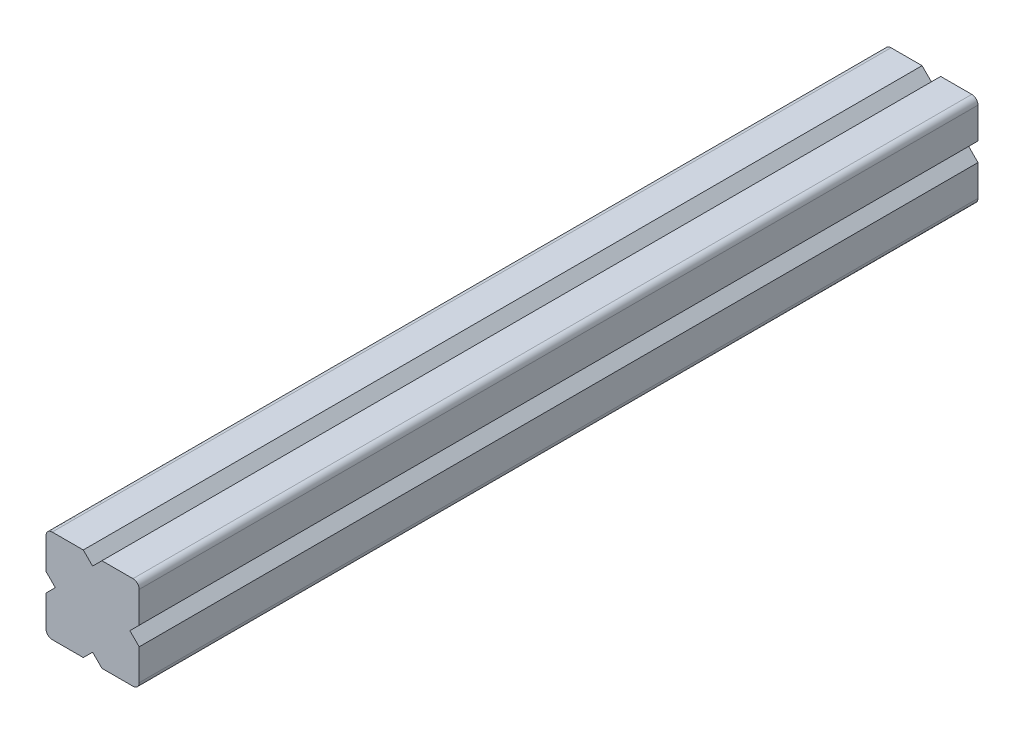
ISO-10303-21;
HEADER;
FILE_DESCRIPTION(('STEP AP214'),'2;1');
FILE_NAME('part.step','',(''),(''),'','','');
FILE_SCHEMA(('AUTOMOTIVE_DESIGN { 1 0 10303 214 1 1 1 1 }'));
ENDSEC;
DATA;
#1=APPLICATION_CONTEXT('core data for automotive mechanical design processes');
#2=APPLICATION_PROTOCOL_DEFINITION('international standard','automotive_design',2000,#1);
#3=PRODUCT_CONTEXT('',#1,'mechanical');
#4=PRODUCT('Part','Part','',(#3));
#5=PRODUCT_RELATED_PRODUCT_CATEGORY('part','',(#4));
#6=PRODUCT_DEFINITION_FORMATION('','',#4);
#7=PRODUCT_DEFINITION_CONTEXT('part definition',#1,'design');
#8=PRODUCT_DEFINITION('design','',#6,#7);
#9=PRODUCT_DEFINITION_SHAPE('','',#8);
#10=(LENGTH_UNIT() NAMED_UNIT(*) SI_UNIT(.MILLI.,.METRE.));
#11=(NAMED_UNIT(*) PLANE_ANGLE_UNIT() SI_UNIT($,.RADIAN.));
#12=(NAMED_UNIT(*) SI_UNIT($,.STERADIAN.) SOLID_ANGLE_UNIT());
#13=UNCERTAINTY_MEASURE_WITH_UNIT(LENGTH_MEASURE(1.E-05),#10,'distance_accuracy_value','');
#14=(GEOMETRIC_REPRESENTATION_CONTEXT(3) GLOBAL_UNCERTAINTY_ASSIGNED_CONTEXT((#13)) GLOBAL_UNIT_ASSIGNED_CONTEXT((#10,
#11,#12)) REPRESENTATION_CONTEXT('',''));
#15=CARTESIAN_POINT('',(0.,0.,0.));
#16=DIRECTION('',(0.,0.,1.));
#17=DIRECTION('',(1.,0.,0.));
#18=AXIS2_PLACEMENT_3D('',#15,#16,#17);
#19=CARTESIAN_POINT('',(15.,0.,135.));
#20=DIRECTION('',(-1.,0.,0.));
#21=DIRECTION('',(0.,-1.,0.));
#22=AXIS2_PLACEMENT_3D('',#19,#20,#21);
#23=PLANE('',#22);
#24=DIRECTION('',(0.,1.,0.));
#25=VECTOR('',#24,1.);
#26=CARTESIAN_POINT('',(15.,0.,-135.));
#27=LINE('',#26,#25);
#28=CARTESIAN_POINT('',(15.,2.9999999999999,-135.));
#29=VERTEX_POINT('',#28);
#30=CARTESIAN_POINT('',(15.,13.,-135.));
#31=VERTEX_POINT('',#30);
#32=EDGE_CURVE('E200',#29,#31,#27,.T.);
#33=ORIENTED_EDGE('',*,*,#32,.T.);
#34=DIRECTION('',(0.,0.,-1.));
#35=VECTOR('',#34,1.);
#36=CARTESIAN_POINT('',(15.,13.,135.));
#37=LINE('',#36,#35);
#38=CARTESIAN_POINT('',(15.,13.,135.));
#39=VERTEX_POINT('',#38);
#40=EDGE_CURVE('E11',#39,#31,#37,.T.);
#41=ORIENTED_EDGE('',*,*,#40,.F.);
#42=DIRECTION('',(0.,1.,0.));
#43=VECTOR('',#42,1.);
#44=CARTESIAN_POINT('',(15.,0.,135.));
#45=LINE('',#44,#43);
#46=CARTESIAN_POINT('',(15.,2.9999999999999,135.));
#47=VERTEX_POINT('',#46);
#48=EDGE_CURVE('E242',#47,#39,#45,.T.);
#49=ORIENTED_EDGE('',*,*,#48,.F.);
#50=DIRECTION('',(0.,0.,-1.));
#51=VECTOR('',#50,1.);
#52=CARTESIAN_POINT('',(15.,2.9999999999999,135.));
#53=LINE('',#52,#51);
#54=EDGE_CURVE('E196',#47,#29,#53,.T.);
#55=ORIENTED_EDGE('',*,*,#54,.T.);
#56=EDGE_LOOP('',(#33,#41,#49,#55));
#57=FACE_BOUND('',#56,.T.);
#58=ADVANCED_FACE('F33',(#57),#23,.F.);
#59=CARTESIAN_POINT('',(13.,13.,135.));
#60=DIRECTION('',(0.,0.,-1.));
#61=DIRECTION('',(-1.,0.,0.));
#62=AXIS2_PLACEMENT_3D('',#59,#60,#61);
#63=CYLINDRICAL_SURFACE('',#62,2.);
#64=CARTESIAN_POINT('',(13.,13.,-135.));
#65=DIRECTION('',(0.,0.,1.));
#66=DIRECTION('',(1.,0.,0.));
#67=AXIS2_PLACEMENT_3D('',#64,#65,#66);
#68=CIRCLE('',#67,2.);
#69=CARTESIAN_POINT('',(13.,15.,-135.));
#70=VERTEX_POINT('',#69);
#71=EDGE_CURVE('E203',#31,#70,#68,.T.);
#72=ORIENTED_EDGE('',*,*,#71,.T.);
#73=DIRECTION('',(0.,0.,-1.));
#74=VECTOR('',#73,1.);
#75=CARTESIAN_POINT('',(13.,15.,135.));
#76=LINE('',#75,#74);
#77=CARTESIAN_POINT('',(13.,15.,135.));
#78=VERTEX_POINT('',#77);
#79=EDGE_CURVE('E41',#78,#70,#76,.T.);
#80=ORIENTED_EDGE('',*,*,#79,.F.);
#81=CARTESIAN_POINT('',(13.,13.,135.));
#82=DIRECTION('',(0.,0.,1.));
#83=DIRECTION('',(1.,0.,0.));
#84=AXIS2_PLACEMENT_3D('',#81,#82,#83);
#85=CIRCLE('',#84,2.);
#86=EDGE_CURVE('E128',#39,#78,#85,.T.);
#87=ORIENTED_EDGE('',*,*,#86,.F.);
#88=ORIENTED_EDGE('',*,*,#40,.T.);
#89=EDGE_LOOP('',(#72,#80,#87,#88));
#90=FACE_BOUND('',#89,.T.);
#91=ADVANCED_FACE('F353',(#90),#63,.T.);
#92=CARTESIAN_POINT('',(0.,15.,135.));
#93=DIRECTION('',(0.,-1.,0.));
#94=DIRECTION('',(1.,0.,0.));
#95=AXIS2_PLACEMENT_3D('',#92,#93,#94);
#96=PLANE('',#95);
#97=DIRECTION('',(-1.,0.,0.));
#98=VECTOR('',#97,1.);
#99=CARTESIAN_POINT('',(0.,15.,-135.));
#100=LINE('',#99,#98);
#101=CARTESIAN_POINT('',(3.00000000000005,15.,-135.));
#102=VERTEX_POINT('',#101);
#103=EDGE_CURVE('E205',#70,#102,#100,.T.);
#104=ORIENTED_EDGE('',*,*,#103,.T.);
#105=DIRECTION('',(0.,0.,-1.));
#106=VECTOR('',#105,1.);
#107=CARTESIAN_POINT('',(3.00000000000005,15.,135.));
#108=LINE('',#107,#106);
#109=CARTESIAN_POINT('',(3.00000000000005,15.,135.));
#110=VERTEX_POINT('',#109);
#111=EDGE_CURVE('E282',#110,#102,#108,.T.);
#112=ORIENTED_EDGE('',*,*,#111,.F.);
#113=DIRECTION('',(-1.,0.,0.));
#114=VECTOR('',#113,1.);
#115=CARTESIAN_POINT('',(0.,15.,135.));
#116=LINE('',#115,#114);
#117=EDGE_CURVE('E290',#78,#110,#116,.T.);
#118=ORIENTED_EDGE('',*,*,#117,.F.);
#119=ORIENTED_EDGE('',*,*,#79,.T.);
#120=EDGE_LOOP('',(#104,#112,#118,#119));
#121=FACE_BOUND('',#120,.T.);
#122=ADVANCED_FACE('F288',(#121),#96,.F.);
#123=CARTESIAN_POINT('',(-5.99999999999994,5.99999999999983,135.));
#124=DIRECTION('',(0.707106781186554,-0.707106781186541,0.));
#125=DIRECTION('',(0.707106781186541,0.707106781186554,0.));
#126=AXIS2_PLACEMENT_3D('',#123,#124,#125);
#127=PLANE('',#126);
#128=DIRECTION('',(-0.707106781186541,-0.707106781186554,0.));
#129=VECTOR('',#128,1.);
#130=CARTESIAN_POINT('',(-5.99999999999994,5.99999999999983,-135.));
#131=LINE('',#130,#129);
#132=CARTESIAN_POINT('',(0.,11.9999999999999,-135.));
#133=VERTEX_POINT('',#132);
#134=EDGE_CURVE('E207',#102,#133,#131,.T.);
#135=ORIENTED_EDGE('',*,*,#134,.T.);
#136=DIRECTION('',(0.,0.,-1.));
#137=VECTOR('',#136,1.);
#138=CARTESIAN_POINT('',(0.,11.9999999999999,135.));
#139=LINE('',#138,#137);
#140=CARTESIAN_POINT('',(0.,11.9999999999999,135.));
#141=VERTEX_POINT('',#140);
#142=EDGE_CURVE('E279',#141,#133,#139,.T.);
#143=ORIENTED_EDGE('',*,*,#142,.F.);
#144=DIRECTION('',(-0.707106781186541,-0.707106781186554,0.));
#145=VECTOR('',#144,1.);
#146=CARTESIAN_POINT('',(-5.99999999999994,5.99999999999983,135.));
#147=LINE('',#146,#145);
#148=EDGE_CURVE('E308',#110,#141,#147,.T.);
#149=ORIENTED_EDGE('',*,*,#148,.F.);
#150=ORIENTED_EDGE('',*,*,#111,.T.);
#151=EDGE_LOOP('',(#135,#143,#149,#150));
#152=FACE_BOUND('',#151,.T.);
#153=ADVANCED_FACE('F299',(#152),#127,.F.);
#154=CARTESIAN_POINT('',(5.99999999999998,5.9999999999998,135.));
#155=DIRECTION('',(-0.707106781186558,-0.707106781186537,0.));
#156=DIRECTION('',(0.707106781186537,-0.707106781186558,0.));
#157=AXIS2_PLACEMENT_3D('',#154,#155,#156);
#158=PLANE('',#157);
#159=DIRECTION('',(-0.707106781186537,0.707106781186558,0.));
#160=VECTOR('',#159,1.);
#161=CARTESIAN_POINT('',(5.99999999999998,5.9999999999998,-135.));
#162=LINE('',#161,#160);
#163=CARTESIAN_POINT('',(-2.99999999999995,15.,-135.));
#164=VERTEX_POINT('',#163);
#165=EDGE_CURVE('E209',#133,#164,#162,.T.);
#166=ORIENTED_EDGE('',*,*,#165,.T.);
#167=DIRECTION('',(0.,0.,-1.));
#168=VECTOR('',#167,1.);
#169=CARTESIAN_POINT('',(-2.99999999999995,15.,135.));
#170=LINE('',#169,#168);
#171=CARTESIAN_POINT('',(-2.99999999999995,15.,135.));
#172=VERTEX_POINT('',#171);
#173=EDGE_CURVE('E276',#172,#164,#170,.T.);
#174=ORIENTED_EDGE('',*,*,#173,.F.);
#175=DIRECTION('',(-0.707106781186537,0.707106781186558,0.));
#176=VECTOR('',#175,1.);
#177=CARTESIAN_POINT('',(5.99999999999998,5.9999999999998,135.));
#178=LINE('',#177,#176);
#179=EDGE_CURVE('E305',#141,#172,#178,.T.);
#180=ORIENTED_EDGE('',*,*,#179,.F.);
#181=ORIENTED_EDGE('',*,*,#142,.T.);
#182=EDGE_LOOP('',(#166,#174,#180,#181));
#183=FACE_BOUND('',#182,.T.);
#184=ADVANCED_FACE('F303',(#183),#158,.F.);
#185=CARTESIAN_POINT('',(0.,15.,135.));
#186=DIRECTION('',(0.,-1.,0.));
#187=DIRECTION('',(1.,0.,0.));
#188=AXIS2_PLACEMENT_3D('',#185,#186,#187);
#189=PLANE('',#188);
#190=DIRECTION('',(-1.,0.,0.));
#191=VECTOR('',#190,1.);
#192=CARTESIAN_POINT('',(0.,15.,-135.));
#193=LINE('',#192,#191);
#194=CARTESIAN_POINT('',(-13.,15.,-135.));
#195=VERTEX_POINT('',#194);
#196=EDGE_CURVE('E211',#164,#195,#193,.T.);
#197=ORIENTED_EDGE('',*,*,#196,.T.);
#198=DIRECTION('',(0.,0.,-1.));
#199=VECTOR('',#198,1.);
#200=CARTESIAN_POINT('',(-13.,15.,135.));
#201=LINE('',#200,#199);
#202=CARTESIAN_POINT('',(-13.,15.,135.));
#203=VERTEX_POINT('',#202);
#204=EDGE_CURVE('E274',#203,#195,#201,.T.);
#205=ORIENTED_EDGE('',*,*,#204,.F.);
#206=DIRECTION('',(-1.,0.,0.));
#207=VECTOR('',#206,1.);
#208=CARTESIAN_POINT('',(0.,15.,135.));
#209=LINE('',#208,#207);
#210=EDGE_CURVE('E307',#172,#203,#209,.T.);
#211=ORIENTED_EDGE('',*,*,#210,.F.);
#212=ORIENTED_EDGE('',*,*,#173,.T.);
#213=EDGE_LOOP('',(#197,#205,#211,#212));
#214=FACE_BOUND('',#213,.T.);
#215=ADVANCED_FACE('F366',(#214),#189,.F.);
#216=CARTESIAN_POINT('',(-13.,13.,135.));
#217=DIRECTION('',(0.,0.,-1.));
#218=DIRECTION('',(-1.,0.,0.));
#219=AXIS2_PLACEMENT_3D('',#216,#217,#218);
#220=CYLINDRICAL_SURFACE('',#219,2.);
#221=CARTESIAN_POINT('',(-13.,13.,-135.));
#222=DIRECTION('',(0.,0.,1.));
#223=DIRECTION('',(1.,0.,0.));
#224=AXIS2_PLACEMENT_3D('',#221,#222,#223);
#225=CIRCLE('',#224,2.);
#226=CARTESIAN_POINT('',(-15.,13.,-135.));
#227=VERTEX_POINT('',#226);
#228=EDGE_CURVE('E214',#227,#195,#225,.F.);
#229=ORIENTED_EDGE('',*,*,#228,.F.);
#230=DIRECTION('',(0.,0.,-1.));
#231=VECTOR('',#230,1.);
#232=CARTESIAN_POINT('',(-15.,13.,135.));
#233=LINE('',#232,#231);
#234=CARTESIAN_POINT('',(-15.,13.,135.));
#235=VERTEX_POINT('',#234);
#236=EDGE_CURVE('E272',#235,#227,#233,.T.);
#237=ORIENTED_EDGE('',*,*,#236,.F.);
#238=CARTESIAN_POINT('',(-13.,13.,135.));
#239=DIRECTION('',(0.,0.,1.));
#240=DIRECTION('',(1.,0.,0.));
#241=AXIS2_PLACEMENT_3D('',#238,#239,#240);
#242=CIRCLE('',#241,2.);
#243=EDGE_CURVE('E310',#235,#203,#242,.F.);
#244=ORIENTED_EDGE('',*,*,#243,.T.);
#245=ORIENTED_EDGE('',*,*,#204,.T.);
#246=EDGE_LOOP('',(#229,#237,#244,#245));
#247=FACE_BOUND('',#246,.T.);
#248=ADVANCED_FACE('F369',(#247),#220,.T.);
#249=CARTESIAN_POINT('',(-15.,0.,135.));
#250=DIRECTION('',(1.,0.,0.));
#251=DIRECTION('',(0.,1.,0.));
#252=AXIS2_PLACEMENT_3D('',#249,#250,#251);
#253=PLANE('',#252);
#254=DIRECTION('',(0.,-1.,0.));
#255=VECTOR('',#254,1.);
#256=CARTESIAN_POINT('',(-15.,0.,-135.));
#257=LINE('',#256,#255);
#258=CARTESIAN_POINT('',(-15.,3.,-135.));
#259=VERTEX_POINT('',#258);
#260=EDGE_CURVE('E217',#227,#259,#257,.T.);
#261=ORIENTED_EDGE('',*,*,#260,.T.);
#262=DIRECTION('',(0.,0.,-1.));
#263=VECTOR('',#262,1.);
#264=CARTESIAN_POINT('',(-15.,3.,135.));
#265=LINE('',#264,#263);
#266=CARTESIAN_POINT('',(-15.,3.,135.));
#267=VERTEX_POINT('',#266);
#268=EDGE_CURVE('E269',#267,#259,#265,.T.);
#269=ORIENTED_EDGE('',*,*,#268,.F.);
#270=DIRECTION('',(0.,-1.,0.));
#271=VECTOR('',#270,1.);
#272=CARTESIAN_POINT('',(-15.,0.,135.));
#273=LINE('',#272,#271);
#274=EDGE_CURVE('E317',#235,#267,#273,.T.);
#275=ORIENTED_EDGE('',*,*,#274,.F.);
#276=ORIENTED_EDGE('',*,*,#236,.T.);
#277=EDGE_LOOP('',(#261,#269,#275,#276));
#278=FACE_BOUND('',#277,.T.);
#279=ADVANCED_FACE('F373',(#278),#253,.F.);
#280=CARTESIAN_POINT('',(-5.99999999999983,-5.99999999999996,135.));
#281=DIRECTION('',(0.70710678118654,0.707106781186555,0.));
#282=DIRECTION('',(-0.707106781186555,0.70710678118654,0.));
#283=AXIS2_PLACEMENT_3D('',#280,#281,#282);
#284=PLANE('',#283);
#285=DIRECTION('',(0.707106781186555,-0.70710678118654,0.));
#286=VECTOR('',#285,1.);
#287=CARTESIAN_POINT('',(-5.99999999999983,-5.99999999999996,-135.));
#288=LINE('',#287,#286);
#289=CARTESIAN_POINT('',(-11.9999999999999,0.,-135.));
#290=VERTEX_POINT('',#289);
#291=EDGE_CURVE('E219',#259,#290,#288,.T.);
#292=ORIENTED_EDGE('',*,*,#291,.T.);
#293=DIRECTION('',(0.,0.,-1.));
#294=VECTOR('',#293,1.);
#295=CARTESIAN_POINT('',(-11.9999999999999,0.,135.));
#296=LINE('',#295,#294);
#297=CARTESIAN_POINT('',(-11.9999999999999,0.,135.));
#298=VERTEX_POINT('',#297);
#299=EDGE_CURVE('E266',#298,#290,#296,.T.);
#300=ORIENTED_EDGE('',*,*,#299,.F.);
#301=DIRECTION('',(0.707106781186555,-0.70710678118654,0.));
#302=VECTOR('',#301,1.);
#303=CARTESIAN_POINT('',(-5.99999999999983,-5.99999999999996,135.));
#304=LINE('',#303,#302);
#305=EDGE_CURVE('E319',#267,#298,#304,.T.);
#306=ORIENTED_EDGE('',*,*,#305,.F.);
#307=ORIENTED_EDGE('',*,*,#268,.T.);
#308=EDGE_LOOP('',(#292,#300,#306,#307));
#309=FACE_BOUND('',#308,.T.);
#310=ADVANCED_FACE('F377',(#309),#284,.F.);
#311=CARTESIAN_POINT('',(-5.99999999999984,5.99999999999996,135.));
#312=DIRECTION('',(0.70710678118654,-0.707106781186555,0.));
#313=DIRECTION('',(0.707106781186555,0.70710678118654,0.));
#314=AXIS2_PLACEMENT_3D('',#311,#312,#313);
#315=PLANE('',#314);
#316=DIRECTION('',(-0.707106781186555,-0.70710678118654,0.));
#317=VECTOR('',#316,1.);
#318=CARTESIAN_POINT('',(-5.99999999999984,5.99999999999996,-135.));
#319=LINE('',#318,#317);
#320=CARTESIAN_POINT('',(-15.,-3.,-135.));
#321=VERTEX_POINT('',#320);
#322=EDGE_CURVE('E221',#290,#321,#319,.T.);
#323=ORIENTED_EDGE('',*,*,#322,.T.);
#324=DIRECTION('',(0.,0.,-1.));
#325=VECTOR('',#324,1.);
#326=CARTESIAN_POINT('',(-15.,-3.,135.));
#327=LINE('',#326,#325);
#328=CARTESIAN_POINT('',(-15.,-3.,135.));
#329=VERTEX_POINT('',#328);
#330=EDGE_CURVE('E263',#329,#321,#327,.T.);
#331=ORIENTED_EDGE('',*,*,#330,.F.);
#332=DIRECTION('',(-0.707106781186555,-0.70710678118654,0.));
#333=VECTOR('',#332,1.);
#334=CARTESIAN_POINT('',(-5.99999999999984,5.99999999999996,135.));
#335=LINE('',#334,#333);
#336=EDGE_CURVE('E321',#298,#329,#335,.T.);
#337=ORIENTED_EDGE('',*,*,#336,.F.);
#338=ORIENTED_EDGE('',*,*,#299,.T.);
#339=EDGE_LOOP('',(#323,#331,#337,#338));
#340=FACE_BOUND('',#339,.T.);
#341=ADVANCED_FACE('F381',(#340),#315,.F.);
#342=CARTESIAN_POINT('',(-15.,0.,135.));
#343=DIRECTION('',(1.,0.,0.));
#344=DIRECTION('',(0.,0.,-1.));
#345=AXIS2_PLACEMENT_3D('',#342,#343,#344);
#346=PLANE('',#345);
#347=DIRECTION('',(0.,-1.,0.));
#348=VECTOR('',#347,1.);
#349=CARTESIAN_POINT('',(-15.,0.,-135.));
#350=LINE('',#349,#348);
#351=CARTESIAN_POINT('',(-15.,-13.,-135.));
#352=VERTEX_POINT('',#351);
#353=EDGE_CURVE('E223',#321,#352,#350,.T.);
#354=ORIENTED_EDGE('',*,*,#353,.T.);
#355=DIRECTION('',(0.,0.,-1.));
#356=VECTOR('',#355,1.);
#357=CARTESIAN_POINT('',(-15.,-13.,135.));
#358=LINE('',#357,#356);
#359=CARTESIAN_POINT('',(-15.,-13.,135.));
#360=VERTEX_POINT('',#359);
#361=EDGE_CURVE('E260',#360,#352,#358,.T.);
#362=ORIENTED_EDGE('',*,*,#361,.F.);
#363=DIRECTION('',(0.,-1.,0.));
#364=VECTOR('',#363,1.);
#365=CARTESIAN_POINT('',(-15.,0.,135.));
#366=LINE('',#365,#364);
#367=EDGE_CURVE('E323',#329,#360,#366,.T.);
#368=ORIENTED_EDGE('',*,*,#367,.F.);
#369=ORIENTED_EDGE('',*,*,#330,.T.);
#370=EDGE_LOOP('',(#354,#362,#368,#369));
#371=FACE_BOUND('',#370,.T.);
#372=ADVANCED_FACE('F385',(#371),#346,.F.);
#373=CARTESIAN_POINT('',(-13.,-13.,135.));
#374=DIRECTION('',(0.,0.,-1.));
#375=DIRECTION('',(-1.,0.,0.));
#376=AXIS2_PLACEMENT_3D('',#373,#374,#375);
#377=CYLINDRICAL_SURFACE('',#376,2.);
#378=CARTESIAN_POINT('',(-13.,-13.,-135.));
#379=DIRECTION('',(0.,0.,1.));
#380=DIRECTION('',(1.,0.,0.));
#381=AXIS2_PLACEMENT_3D('',#378,#379,#380);
#382=CIRCLE('',#381,2.);
#383=CARTESIAN_POINT('',(-13.,-15.,-135.));
#384=VERTEX_POINT('',#383);
#385=EDGE_CURVE('E225',#352,#384,#382,.T.);
#386=ORIENTED_EDGE('',*,*,#385,.T.);
#387=DIRECTION('',(0.,0.,-1.));
#388=VECTOR('',#387,1.);
#389=CARTESIAN_POINT('',(-13.,-15.,135.));
#390=LINE('',#389,#388);
#391=CARTESIAN_POINT('',(-13.,-15.,135.));
#392=VERTEX_POINT('',#391);
#393=EDGE_CURVE('E257',#392,#384,#390,.T.);
#394=ORIENTED_EDGE('',*,*,#393,.F.);
#395=CARTESIAN_POINT('',(-13.,-13.,135.));
#396=DIRECTION('',(0.,0.,1.));
#397=DIRECTION('',(1.,0.,0.));
#398=AXIS2_PLACEMENT_3D('',#395,#396,#397);
#399=CIRCLE('',#398,2.);
#400=EDGE_CURVE('E325',#360,#392,#399,.T.);
#401=ORIENTED_EDGE('',*,*,#400,.F.);
#402=ORIENTED_EDGE('',*,*,#361,.T.);
#403=EDGE_LOOP('',(#386,#394,#401,#402));
#404=FACE_BOUND('',#403,.T.);
#405=ADVANCED_FACE('F389',(#404),#377,.T.);
#406=CARTESIAN_POINT('',(0.,-14.9999999999999,135.));
#407=DIRECTION('',(0.,1.,0.));
#408=DIRECTION('',(-1.,0.,0.));
#409=AXIS2_PLACEMENT_3D('',#406,#407,#408);
#410=PLANE('',#409);
#411=DIRECTION('',(1.,0.,0.));
#412=VECTOR('',#411,1.);
#413=CARTESIAN_POINT('',(0.,-14.9999999999999,-135.));
#414=LINE('',#413,#412);
#415=CARTESIAN_POINT('',(-3.00000000000015,-15.,-135.));
#416=VERTEX_POINT('',#415);
#417=EDGE_CURVE('E227',#384,#416,#414,.T.);
#418=ORIENTED_EDGE('',*,*,#417,.T.);
#419=DIRECTION('',(0.,0.,-1.));
#420=VECTOR('',#419,1.);
#421=CARTESIAN_POINT('',(-3.00000000000015,-15.,135.));
#422=LINE('',#421,#420);
#423=CARTESIAN_POINT('',(-3.00000000000015,-15.,135.));
#424=VERTEX_POINT('',#423);
#425=EDGE_CURVE('E254',#424,#416,#422,.T.);
#426=ORIENTED_EDGE('',*,*,#425,.F.);
#427=DIRECTION('',(1.,0.,0.));
#428=VECTOR('',#427,1.);
#429=CARTESIAN_POINT('',(0.,-14.9999999999999,135.));
#430=LINE('',#429,#428);
#431=EDGE_CURVE('E327',#392,#424,#430,.T.);
#432=ORIENTED_EDGE('',*,*,#431,.F.);
#433=ORIENTED_EDGE('',*,*,#393,.T.);
#434=EDGE_LOOP('',(#418,#426,#432,#433));
#435=FACE_BOUND('',#434,.T.);
#436=ADVANCED_FACE('F393',(#435),#410,.F.);
#437=CARTESIAN_POINT('',(5.9999999999999,-5.99999999999987,135.));
#438=DIRECTION('',(-0.707106781186549,0.707106781186546,0.));
#439=DIRECTION('',(-0.707106781186546,-0.707106781186549,0.));
#440=AXIS2_PLACEMENT_3D('',#437,#438,#439);
#441=PLANE('',#440);
#442=DIRECTION('',(0.707106781186546,0.707106781186549,0.));
#443=VECTOR('',#442,1.);
#444=CARTESIAN_POINT('',(5.9999999999999,-5.99999999999987,-135.));
#445=LINE('',#444,#443);
#446=CARTESIAN_POINT('',(-1.25767452008319E-13,-11.9999999999999,-135.));
#447=VERTEX_POINT('',#446);
#448=EDGE_CURVE('E229',#416,#447,#445,.T.);
#449=ORIENTED_EDGE('',*,*,#448,.T.);
#450=DIRECTION('',(0.,0.,-1.));
#451=VECTOR('',#450,1.);
#452=CARTESIAN_POINT('',(-1.25767452008319E-13,-11.9999999999999,135.));
#453=LINE('',#452,#451);
#454=CARTESIAN_POINT('',(-1.25767452008319E-13,-11.9999999999999,135.));
#455=VERTEX_POINT('',#454);
#456=EDGE_CURVE('E251',#455,#447,#453,.T.);
#457=ORIENTED_EDGE('',*,*,#456,.F.);
#458=DIRECTION('',(0.707106781186546,0.707106781186549,0.));
#459=VECTOR('',#458,1.);
#460=CARTESIAN_POINT('',(5.9999999999999,-5.99999999999987,135.));
#461=LINE('',#460,#459);
#462=EDGE_CURVE('E329',#424,#455,#461,.T.);
#463=ORIENTED_EDGE('',*,*,#462,.F.);
#464=ORIENTED_EDGE('',*,*,#425,.T.);
#465=EDGE_LOOP('',(#449,#457,#463,#464));
#466=FACE_BOUND('',#465,.T.);
#467=ADVANCED_FACE('F397',(#466),#441,.F.);
#468=CARTESIAN_POINT('',(-6.00000000000002,-5.99999999999976,135.));
#469=DIRECTION('',(0.707106781186563,0.707106781186532,0.));
#470=DIRECTION('',(-0.707106781186532,0.707106781186563,0.));
#471=AXIS2_PLACEMENT_3D('',#468,#469,#470);
#472=PLANE('',#471);
#473=DIRECTION('',(0.707106781186532,-0.707106781186563,0.));
#474=VECTOR('',#473,1.);
#475=CARTESIAN_POINT('',(-6.00000000000002,-5.99999999999976,-135.));
#476=LINE('',#475,#474);
#477=CARTESIAN_POINT('',(2.99999999999985,-15.,-135.));
#478=VERTEX_POINT('',#477);
#479=EDGE_CURVE('E231',#447,#478,#476,.T.);
#480=ORIENTED_EDGE('',*,*,#479,.T.);
#481=DIRECTION('',(0.,0.,-1.));
#482=VECTOR('',#481,1.);
#483=CARTESIAN_POINT('',(2.99999999999985,-15.,135.));
#484=LINE('',#483,#482);
#485=CARTESIAN_POINT('',(2.99999999999985,-15.,135.));
#486=VERTEX_POINT('',#485);
#487=EDGE_CURVE('E248',#486,#478,#484,.T.);
#488=ORIENTED_EDGE('',*,*,#487,.F.);
#489=DIRECTION('',(0.707106781186532,-0.707106781186563,0.));
#490=VECTOR('',#489,1.);
#491=CARTESIAN_POINT('',(-6.00000000000002,-5.99999999999976,135.));
#492=LINE('',#491,#490);
#493=EDGE_CURVE('E331',#455,#486,#492,.T.);
#494=ORIENTED_EDGE('',*,*,#493,.F.);
#495=ORIENTED_EDGE('',*,*,#456,.T.);
#496=EDGE_LOOP('',(#480,#488,#494,#495));
#497=FACE_BOUND('',#496,.T.);
#498=ADVANCED_FACE('F401',(#497),#472,.F.);
#499=CARTESIAN_POINT('',(0.,-15.,135.));
#500=DIRECTION('',(0.,1.,0.));
#501=DIRECTION('',(-1.,0.,0.));
#502=AXIS2_PLACEMENT_3D('',#499,#500,#501);
#503=PLANE('',#502);
#504=DIRECTION('',(1.,0.,0.));
#505=VECTOR('',#504,1.);
#506=CARTESIAN_POINT('',(0.,-15.,-135.));
#507=LINE('',#506,#505);
#508=CARTESIAN_POINT('',(13.,-15.,-135.));
#509=VERTEX_POINT('',#508);
#510=EDGE_CURVE('E233',#478,#509,#507,.T.);
#511=ORIENTED_EDGE('',*,*,#510,.T.);
#512=DIRECTION('',(0.,0.,-1.));
#513=VECTOR('',#512,1.);
#514=CARTESIAN_POINT('',(13.,-15.,135.));
#515=LINE('',#514,#513);
#516=CARTESIAN_POINT('',(13.,-15.,135.));
#517=VERTEX_POINT('',#516);
#518=EDGE_CURVE('E246',#517,#509,#515,.T.);
#519=ORIENTED_EDGE('',*,*,#518,.F.);
#520=DIRECTION('',(1.,0.,0.));
#521=VECTOR('',#520,1.);
#522=CARTESIAN_POINT('',(0.,-15.,135.));
#523=LINE('',#522,#521);
#524=EDGE_CURVE('E333',#486,#517,#523,.T.);
#525=ORIENTED_EDGE('',*,*,#524,.F.);
#526=ORIENTED_EDGE('',*,*,#487,.T.);
#527=EDGE_LOOP('',(#511,#519,#525,#526));
#528=FACE_BOUND('',#527,.T.);
#529=ADVANCED_FACE('F405',(#528),#503,.F.);
#530=CARTESIAN_POINT('',(13.,-13.,135.));
#531=DIRECTION('',(0.,0.,-1.));
#532=DIRECTION('',(-1.,0.,0.));
#533=AXIS2_PLACEMENT_3D('',#530,#531,#532);
#534=CYLINDRICAL_SURFACE('',#533,2.);
#535=CARTESIAN_POINT('',(13.,-13.,-135.));
#536=DIRECTION('',(0.,0.,1.));
#537=DIRECTION('',(1.,0.,0.));
#538=AXIS2_PLACEMENT_3D('',#535,#536,#537);
#539=CIRCLE('',#538,2.);
#540=CARTESIAN_POINT('',(15.,-13.,-135.));
#541=VERTEX_POINT('',#540);
#542=EDGE_CURVE('E236',#541,#509,#539,.F.);
#543=ORIENTED_EDGE('',*,*,#542,.F.);
#544=DIRECTION('',(0.,0.,-1.));
#545=VECTOR('',#544,1.);
#546=CARTESIAN_POINT('',(15.,-13.,135.));
#547=LINE('',#546,#545);
#548=CARTESIAN_POINT('',(15.,-13.,135.));
#549=VERTEX_POINT('',#548);
#550=EDGE_CURVE('E191',#549,#541,#547,.T.);
#551=ORIENTED_EDGE('',*,*,#550,.F.);
#552=CARTESIAN_POINT('',(13.,-13.,135.));
#553=DIRECTION('',(0.,0.,1.));
#554=DIRECTION('',(1.,0.,0.));
#555=AXIS2_PLACEMENT_3D('',#552,#553,#554);
#556=CIRCLE('',#555,2.);
#557=EDGE_CURVE('E184',#549,#517,#556,.F.);
#558=ORIENTED_EDGE('',*,*,#557,.T.);
#559=ORIENTED_EDGE('',*,*,#518,.T.);
#560=EDGE_LOOP('',(#543,#551,#558,#559));
#561=FACE_BOUND('',#560,.T.);
#562=ADVANCED_FACE('F336',(#561),#534,.T.);
#563=CARTESIAN_POINT('',(15.,0.,135.));
#564=DIRECTION('',(-1.,0.,0.));
#565=DIRECTION('',(0.,-1.,0.));
#566=AXIS2_PLACEMENT_3D('',#563,#564,#565);
#567=PLANE('',#566);
#568=DIRECTION('',(0.,1.,0.));
#569=VECTOR('',#568,1.);
#570=CARTESIAN_POINT('',(15.,0.,-135.));
#571=LINE('',#570,#569);
#572=CARTESIAN_POINT('',(15.,-3.0000000000001,-135.));
#573=VERTEX_POINT('',#572);
#574=EDGE_CURVE('E190',#541,#573,#571,.T.);
#575=ORIENTED_EDGE('',*,*,#574,.T.);
#576=DIRECTION('',(0.,0.,-1.));
#577=VECTOR('',#576,1.);
#578=CARTESIAN_POINT('',(15.,-3.0000000000001,135.));
#579=LINE('',#578,#577);
#580=CARTESIAN_POINT('',(15.,-3.0000000000001,135.));
#581=VERTEX_POINT('',#580);
#582=EDGE_CURVE('E187',#581,#573,#579,.T.);
#583=ORIENTED_EDGE('',*,*,#582,.F.);
#584=DIRECTION('',(0.,1.,0.));
#585=VECTOR('',#584,1.);
#586=CARTESIAN_POINT('',(15.,0.,135.));
#587=LINE('',#586,#585);
#588=EDGE_CURVE('E178',#549,#581,#587,.T.);
#589=ORIENTED_EDGE('',*,*,#588,.F.);
#590=ORIENTED_EDGE('',*,*,#550,.T.);
#591=EDGE_LOOP('',(#575,#583,#589,#590));
#592=FACE_BOUND('',#591,.T.);
#593=ADVANCED_FACE('F188',(#592),#567,.F.);
#594=CARTESIAN_POINT('',(5.99999999999985,5.99999999999992,135.));
#595=DIRECTION('',(-0.707106781186544,-0.707106781186551,0.));
#596=DIRECTION('',(0.707106781186551,-0.707106781186544,0.));
#597=AXIS2_PLACEMENT_3D('',#594,#595,#596);
#598=PLANE('',#597);
#599=DIRECTION('',(-0.707106781186551,0.707106781186544,0.));
#600=VECTOR('',#599,1.);
#601=CARTESIAN_POINT('',(5.99999999999985,5.99999999999992,-135.));
#602=LINE('',#601,#600);
#603=CARTESIAN_POINT('',(11.9999999999999,0.,-135.));
#604=VERTEX_POINT('',#603);
#605=EDGE_CURVE('E114',#573,#604,#602,.T.);
#606=ORIENTED_EDGE('',*,*,#605,.T.);
#607=DIRECTION('',(0.,0.,-1.));
#608=VECTOR('',#607,1.);
#609=CARTESIAN_POINT('',(11.9999999999999,0.,135.));
#610=LINE('',#609,#608);
#611=CARTESIAN_POINT('',(11.9999999999999,0.,135.));
#612=VERTEX_POINT('',#611);
#613=EDGE_CURVE('E192',#612,#604,#610,.T.);
#614=ORIENTED_EDGE('',*,*,#613,.F.);
#615=DIRECTION('',(-0.707106781186551,0.707106781186544,0.));
#616=VECTOR('',#615,1.);
#617=CARTESIAN_POINT('',(5.99999999999985,5.99999999999992,135.));
#618=LINE('',#617,#616);
#619=EDGE_CURVE('E182',#581,#612,#618,.T.);
#620=ORIENTED_EDGE('',*,*,#619,.F.);
#621=ORIENTED_EDGE('',*,*,#582,.T.);
#622=EDGE_LOOP('',(#606,#614,#620,#621));
#623=FACE_BOUND('',#622,.T.);
#624=ADVANCED_FACE('F194',(#623),#598,.F.);
#625=CARTESIAN_POINT('',(5.99999999999978,-6.,135.));
#626=DIRECTION('',(-0.707106781186535,0.707106781186561,0.));
#627=DIRECTION('',(-0.707106781186561,-0.707106781186535,0.));
#628=AXIS2_PLACEMENT_3D('',#625,#626,#627);
#629=PLANE('',#628);
#630=DIRECTION('',(0.707106781186561,0.707106781186535,0.));
#631=VECTOR('',#630,1.);
#632=CARTESIAN_POINT('',(5.99999999999978,-6.,-135.));
#633=LINE('',#632,#631);
#634=EDGE_CURVE('E120',#604,#29,#633,.T.);
#635=ORIENTED_EDGE('',*,*,#634,.T.);
#636=ORIENTED_EDGE('',*,*,#54,.F.);
#637=DIRECTION('',(0.707106781186561,0.707106781186535,0.));
#638=VECTOR('',#637,1.);
#639=CARTESIAN_POINT('',(5.99999999999978,-6.,135.));
#640=LINE('',#639,#638);
#641=EDGE_CURVE('E49',#612,#47,#640,.T.);
#642=ORIENTED_EDGE('',*,*,#641,.F.);
#643=ORIENTED_EDGE('',*,*,#613,.T.);
#644=EDGE_LOOP('',(#635,#636,#642,#643));
#645=FACE_BOUND('',#644,.T.);
#646=ADVANCED_FACE('F342',(#645),#629,.F.);
#647=CARTESIAN_POINT('',(0.,0.,135.));
#648=DIRECTION('',(0.,0.,1.));
#649=DIRECTION('',(1.,0.,0.));
#650=AXIS2_PLACEMENT_3D('',#647,#648,#649);
#651=PLANE('',#650);
#652=ORIENTED_EDGE('',*,*,#48,.T.);
#653=ORIENTED_EDGE('',*,*,#86,.T.);
#654=ORIENTED_EDGE('',*,*,#117,.T.);
#655=ORIENTED_EDGE('',*,*,#148,.T.);
#656=ORIENTED_EDGE('',*,*,#179,.T.);
#657=ORIENTED_EDGE('',*,*,#210,.T.);
#658=ORIENTED_EDGE('',*,*,#243,.F.);
#659=ORIENTED_EDGE('',*,*,#274,.T.);
#660=ORIENTED_EDGE('',*,*,#305,.T.);
#661=ORIENTED_EDGE('',*,*,#336,.T.);
#662=ORIENTED_EDGE('',*,*,#367,.T.);
#663=ORIENTED_EDGE('',*,*,#400,.T.);
#664=ORIENTED_EDGE('',*,*,#431,.T.);
#665=ORIENTED_EDGE('',*,*,#462,.T.);
#666=ORIENTED_EDGE('',*,*,#493,.T.);
#667=ORIENTED_EDGE('',*,*,#524,.T.);
#668=ORIENTED_EDGE('',*,*,#557,.F.);
#669=ORIENTED_EDGE('',*,*,#588,.T.);
#670=ORIENTED_EDGE('',*,*,#619,.T.);
#671=ORIENTED_EDGE('',*,*,#641,.T.);
#672=EDGE_LOOP('',(#652,#653,#654,#655,#656,#657,#658,#659,#660,#661,#662,#663,#664,#665,#666,
#667,#668,#669,#670,#671));
#673=FACE_BOUND('',#672,.T.);
#674=ADVANCED_FACE('F180',(#673),#651,.T.);
#675=CARTESIAN_POINT('',(0.,0.,-135.));
#676=DIRECTION('',(0.,0.,1.));
#677=DIRECTION('',(1.,0.,0.));
#678=AXIS2_PLACEMENT_3D('',#675,#676,#677);
#679=PLANE('',#678);
#680=ORIENTED_EDGE('',*,*,#32,.F.);
#681=ORIENTED_EDGE('',*,*,#634,.F.);
#682=ORIENTED_EDGE('',*,*,#605,.F.);
#683=ORIENTED_EDGE('',*,*,#574,.F.);
#684=ORIENTED_EDGE('',*,*,#542,.T.);
#685=ORIENTED_EDGE('',*,*,#510,.F.);
#686=ORIENTED_EDGE('',*,*,#479,.F.);
#687=ORIENTED_EDGE('',*,*,#448,.F.);
#688=ORIENTED_EDGE('',*,*,#417,.F.);
#689=ORIENTED_EDGE('',*,*,#385,.F.);
#690=ORIENTED_EDGE('',*,*,#353,.F.);
#691=ORIENTED_EDGE('',*,*,#322,.F.);
#692=ORIENTED_EDGE('',*,*,#291,.F.);
#693=ORIENTED_EDGE('',*,*,#260,.F.);
#694=ORIENTED_EDGE('',*,*,#228,.T.);
#695=ORIENTED_EDGE('',*,*,#196,.F.);
#696=ORIENTED_EDGE('',*,*,#165,.F.);
#697=ORIENTED_EDGE('',*,*,#134,.F.);
#698=ORIENTED_EDGE('',*,*,#103,.F.);
#699=ORIENTED_EDGE('',*,*,#71,.F.);
#700=EDGE_LOOP('',(#680,#681,#682,#683,#684,#685,#686,#687,#688,#689,#690,#691,#692,#693,#694,
#695,#696,#697,#698,#699));
#701=FACE_BOUND('',#700,.T.);
#702=ADVANCED_FACE('F294',(#701),#679,.F.);
#703=CLOSED_SHELL('',(#58,#91,#122,#153,#184,#215,#248,#279,#310,#341,#372,#405,#436,#467,#498,
#529,#562,#593,#624,#646,#674,#702));
#704=MANIFOLD_SOLID_BREP('B2',#703);
#705=ADVANCED_BREP_SHAPE_REPRESENTATION('',(#18,#704),#14);
#706=SHAPE_DEFINITION_REPRESENTATION(#9,#705);
ENDSEC;
END-ISO-10303-21;
